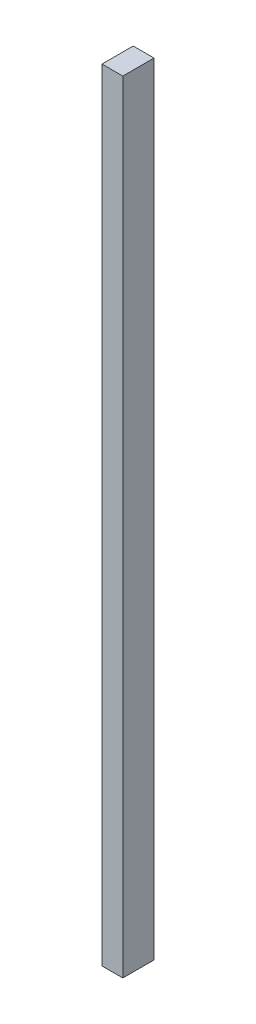
ISO-10303-21;
HEADER;
FILE_DESCRIPTION(('STEP AP214'),'2;1');
FILE_NAME('part.step','',(''),(''),'','','');
FILE_SCHEMA(('AUTOMOTIVE_DESIGN { 1 0 10303 214 1 1 1 1 }'));
ENDSEC;
DATA;
#1=APPLICATION_CONTEXT('core data for automotive mechanical design processes');
#2=APPLICATION_PROTOCOL_DEFINITION('international standard','automotive_design',2000,#1);
#3=PRODUCT_CONTEXT('',#1,'mechanical');
#4=PRODUCT('Part','Part','',(#3));
#5=PRODUCT_RELATED_PRODUCT_CATEGORY('part','',(#4));
#6=PRODUCT_DEFINITION_FORMATION('','',#4);
#7=PRODUCT_DEFINITION_CONTEXT('part definition',#1,'design');
#8=PRODUCT_DEFINITION('design','',#6,#7);
#9=PRODUCT_DEFINITION_SHAPE('','',#8);
#10=(LENGTH_UNIT() NAMED_UNIT(*) SI_UNIT(.MILLI.,.METRE.));
#11=(NAMED_UNIT(*) PLANE_ANGLE_UNIT() SI_UNIT($,.RADIAN.));
#12=(NAMED_UNIT(*) SI_UNIT($,.STERADIAN.) SOLID_ANGLE_UNIT());
#13=UNCERTAINTY_MEASURE_WITH_UNIT(LENGTH_MEASURE(1.E-05),#10,'distance_accuracy_value','');
#14=(GEOMETRIC_REPRESENTATION_CONTEXT(3) GLOBAL_UNCERTAINTY_ASSIGNED_CONTEXT((#13)) GLOBAL_UNIT_ASSIGNED_CONTEXT((#10,
#11,#12)) REPRESENTATION_CONTEXT('',''));
#15=CARTESIAN_POINT('',(0.,0.,0.));
#16=DIRECTION('',(0.,0.,1.));
#17=DIRECTION('',(1.,0.,0.));
#18=AXIS2_PLACEMENT_3D('',#15,#16,#17);
#19=CARTESIAN_POINT('',(3.999999999999,300.,6.00000000000001));
#20=DIRECTION('',(-1.,0.,0.));
#21=DIRECTION('',(0.,0.,1.));
#22=AXIS2_PLACEMENT_3D('',#19,#20,#21);
#23=PLANE('',#22);
#24=DIRECTION('',(0.,0.,-1.));
#25=VECTOR('',#24,1.);
#26=CARTESIAN_POINT('',(4.,0.,6.00000000000001));
#27=LINE('',#26,#25);
#28=CARTESIAN_POINT('',(4.,0.,6.00000000000001));
#29=VERTEX_POINT('',#28);
#30=CARTESIAN_POINT('',(4.,0.,-6.00000000000001));
#31=VERTEX_POINT('',#30);
#32=EDGE_CURVE('E105',#29,#31,#27,.T.);
#33=ORIENTED_EDGE('',*,*,#32,.T.);
#34=DIRECTION('',(0.,-1.,0.));
#35=VECTOR('',#34,1.);
#36=CARTESIAN_POINT('',(3.999999999999,300.,-6.00000000000001));
#37=LINE('',#36,#35);
#38=CARTESIAN_POINT('',(3.999999999999,300.,-6.00000000000001));
#39=VERTEX_POINT('',#38);
#40=EDGE_CURVE('E11',#39,#31,#37,.T.);
#41=ORIENTED_EDGE('',*,*,#40,.F.);
#42=DIRECTION('',(0.,0.,-1.));
#43=VECTOR('',#42,1.);
#44=CARTESIAN_POINT('',(3.999999999999,300.,6.00000000000001));
#45=LINE('',#44,#43);
#46=CARTESIAN_POINT('',(3.999999999999,300.,6.00000000000001));
#47=VERTEX_POINT('',#46);
#48=EDGE_CURVE('E88',#47,#39,#45,.T.);
#49=ORIENTED_EDGE('',*,*,#48,.F.);
#50=DIRECTION('',(0.,-1.,0.));
#51=VECTOR('',#50,1.);
#52=CARTESIAN_POINT('',(3.999999999999,300.,6.00000000000001));
#53=LINE('',#52,#51);
#54=EDGE_CURVE('E101',#47,#29,#53,.T.);
#55=ORIENTED_EDGE('',*,*,#54,.T.);
#56=EDGE_LOOP('',(#33,#41,#49,#55));
#57=FACE_BOUND('',#56,.T.);
#58=ADVANCED_FACE('F36',(#57),#23,.F.);
#59=CARTESIAN_POINT('',(-4.000000000001,300.,-6.00000000000001));
#60=DIRECTION('',(0.,0.,1.));
#61=DIRECTION('',(1.,0.,0.));
#62=AXIS2_PLACEMENT_3D('',#59,#60,#61);
#63=PLANE('',#62);
#64=DIRECTION('',(-1.,0.,0.));
#65=VECTOR('',#64,1.);
#66=CARTESIAN_POINT('',(-4.,0.,-6.00000000000001));
#67=LINE('',#66,#65);
#68=CARTESIAN_POINT('',(-4.,0.,-6.00000000000001));
#69=VERTEX_POINT('',#68);
#70=EDGE_CURVE('E93',#31,#69,#67,.T.);
#71=ORIENTED_EDGE('',*,*,#70,.T.);
#72=DIRECTION('',(0.,-1.,0.));
#73=VECTOR('',#72,1.);
#74=CARTESIAN_POINT('',(-4.000000000001,300.,-6.00000000000001));
#75=LINE('',#74,#73);
#76=CARTESIAN_POINT('',(-4.000000000001,300.,-6.00000000000001));
#77=VERTEX_POINT('',#76);
#78=EDGE_CURVE('E45',#77,#69,#75,.T.);
#79=ORIENTED_EDGE('',*,*,#78,.F.);
#80=DIRECTION('',(-1.,0.,0.));
#81=VECTOR('',#80,1.);
#82=CARTESIAN_POINT('',(-4.000000000001,300.,-6.00000000000001));
#83=LINE('',#82,#81);
#84=EDGE_CURVE('E83',#39,#77,#83,.T.);
#85=ORIENTED_EDGE('',*,*,#84,.F.);
#86=ORIENTED_EDGE('',*,*,#40,.T.);
#87=EDGE_LOOP('',(#71,#79,#85,#86));
#88=FACE_BOUND('',#87,.T.);
#89=ADVANCED_FACE('F92',(#88),#63,.F.);
#90=CARTESIAN_POINT('',(-4.000000000001,300.,6.00000000000001));
#91=DIRECTION('',(1.,0.,0.));
#92=DIRECTION('',(0.,0.,-1.));
#93=AXIS2_PLACEMENT_3D('',#90,#91,#92);
#94=PLANE('',#93);
#95=DIRECTION('',(0.,0.,1.));
#96=VECTOR('',#95,1.);
#97=CARTESIAN_POINT('',(-4.,0.,6.00000000000001));
#98=LINE('',#97,#96);
#99=CARTESIAN_POINT('',(-4.,0.,6.00000000000001));
#100=VERTEX_POINT('',#99);
#101=EDGE_CURVE('E70',#69,#100,#98,.T.);
#102=ORIENTED_EDGE('',*,*,#101,.T.);
#103=DIRECTION('',(0.,-1.,0.));
#104=VECTOR('',#103,1.);
#105=CARTESIAN_POINT('',(-4.000000000001,300.,6.00000000000001));
#106=LINE('',#105,#104);
#107=CARTESIAN_POINT('',(-4.000000000001,300.,6.00000000000001));
#108=VERTEX_POINT('',#107);
#109=EDGE_CURVE('E95',#108,#100,#106,.T.);
#110=ORIENTED_EDGE('',*,*,#109,.F.);
#111=DIRECTION('',(0.,0.,1.));
#112=VECTOR('',#111,1.);
#113=CARTESIAN_POINT('',(-4.000000000001,300.,6.00000000000001));
#114=LINE('',#113,#112);
#115=EDGE_CURVE('E86',#77,#108,#114,.T.);
#116=ORIENTED_EDGE('',*,*,#115,.F.);
#117=ORIENTED_EDGE('',*,*,#78,.T.);
#118=EDGE_LOOP('',(#102,#110,#116,#117));
#119=FACE_BOUND('',#118,.T.);
#120=ADVANCED_FACE('F96',(#119),#94,.F.);
#121=CARTESIAN_POINT('',(-4.000000000001,300.,6.00000000000001));
#122=DIRECTION('',(0.,0.,-1.));
#123=DIRECTION('',(-1.,0.,0.));
#124=AXIS2_PLACEMENT_3D('',#121,#122,#123);
#125=PLANE('',#124);
#126=DIRECTION('',(1.,0.,0.));
#127=VECTOR('',#126,1.);
#128=CARTESIAN_POINT('',(-4.,0.,6.00000000000001));
#129=LINE('',#128,#127);
#130=EDGE_CURVE('E76',#100,#29,#129,.T.);
#131=ORIENTED_EDGE('',*,*,#130,.T.);
#132=ORIENTED_EDGE('',*,*,#54,.F.);
#133=DIRECTION('',(1.,0.,0.));
#134=VECTOR('',#133,1.);
#135=CARTESIAN_POINT('',(-4.000000000001,300.,6.00000000000001));
#136=LINE('',#135,#134);
#137=EDGE_CURVE('E53',#108,#47,#136,.T.);
#138=ORIENTED_EDGE('',*,*,#137,.F.);
#139=ORIENTED_EDGE('',*,*,#109,.T.);
#140=EDGE_LOOP('',(#131,#132,#138,#139));
#141=FACE_BOUND('',#140,.T.);
#142=ADVANCED_FACE('F119',(#141),#125,.F.);
#143=CARTESIAN_POINT('',(-9.99200722162641E-13,300.,0.));
#144=DIRECTION('',(0.,-1.,0.));
#145=DIRECTION('',(0.,0.,-1.));
#146=AXIS2_PLACEMENT_3D('',#143,#144,#145);
#147=PLANE('',#146);
#148=ORIENTED_EDGE('',*,*,#48,.T.);
#149=ORIENTED_EDGE('',*,*,#84,.T.);
#150=ORIENTED_EDGE('',*,*,#115,.T.);
#151=ORIENTED_EDGE('',*,*,#137,.T.);
#152=EDGE_LOOP('',(#148,#149,#150,#151));
#153=FACE_BOUND('',#152,.T.);
#154=ADVANCED_FACE('F84',(#153),#147,.F.);
#155=CARTESIAN_POINT('',(0.,0.,0.));
#156=DIRECTION('',(0.,-1.,0.));
#157=DIRECTION('',(0.,0.,-1.));
#158=AXIS2_PLACEMENT_3D('',#155,#156,#157);
#159=PLANE('',#158);
#160=ORIENTED_EDGE('',*,*,#32,.F.);
#161=ORIENTED_EDGE('',*,*,#130,.F.);
#162=ORIENTED_EDGE('',*,*,#101,.F.);
#163=ORIENTED_EDGE('',*,*,#70,.F.);
#164=EDGE_LOOP('',(#160,#161,#162,#163));
#165=FACE_BOUND('',#164,.T.);
#166=ADVANCED_FACE('F122',(#165),#159,.T.);
#167=CLOSED_SHELL('',(#58,#89,#120,#142,#154,#166));
#168=MANIFOLD_SOLID_BREP('B2',#167);
#169=ADVANCED_BREP_SHAPE_REPRESENTATION('',(#18,#168),#14);
#170=SHAPE_DEFINITION_REPRESENTATION(#9,#169);
ENDSEC;
END-ISO-10303-21;
